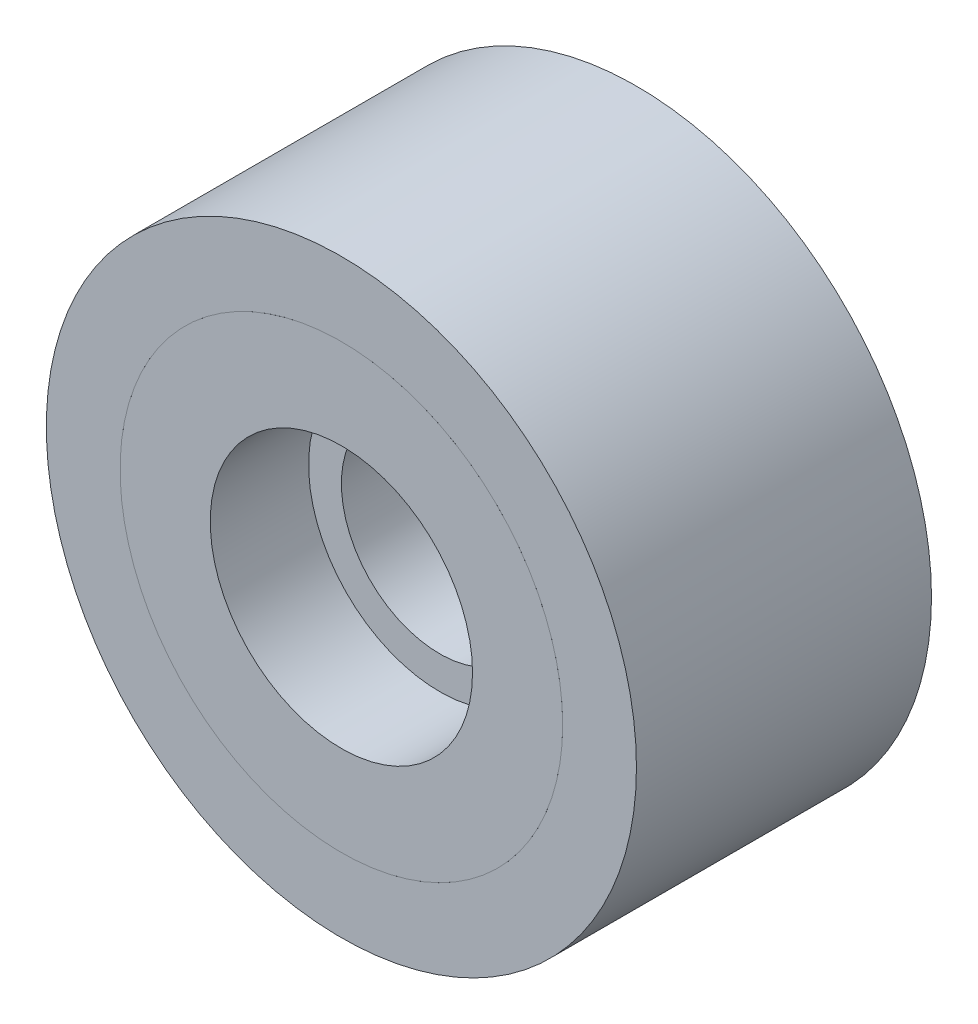
ISO-10303-21;
HEADER;
FILE_DESCRIPTION(('STEP AP214'),'2;1');
FILE_NAME('part.step','',(''),(''),'','','');
FILE_SCHEMA(('AUTOMOTIVE_DESIGN { 1 0 10303 214 1 1 1 1 }'));
ENDSEC;
DATA;
#1=APPLICATION_CONTEXT('core data for automotive mechanical design processes');
#2=APPLICATION_PROTOCOL_DEFINITION('international standard','automotive_design',2000,#1);
#3=PRODUCT_CONTEXT('',#1,'mechanical');
#4=PRODUCT('Part','Part','',(#3));
#5=PRODUCT_RELATED_PRODUCT_CATEGORY('part','',(#4));
#6=PRODUCT_DEFINITION_FORMATION('','',#4);
#7=PRODUCT_DEFINITION_CONTEXT('part definition',#1,'design');
#8=PRODUCT_DEFINITION('design','',#6,#7);
#9=PRODUCT_DEFINITION_SHAPE('','',#8);
#10=(LENGTH_UNIT() NAMED_UNIT(*) SI_UNIT(.MILLI.,.METRE.));
#11=(NAMED_UNIT(*) PLANE_ANGLE_UNIT() SI_UNIT($,.RADIAN.));
#12=(NAMED_UNIT(*) SI_UNIT($,.STERADIAN.) SOLID_ANGLE_UNIT());
#13=UNCERTAINTY_MEASURE_WITH_UNIT(LENGTH_MEASURE(1.E-05),#10,'distance_accuracy_value','');
#14=(GEOMETRIC_REPRESENTATION_CONTEXT(3) GLOBAL_UNCERTAINTY_ASSIGNED_CONTEXT((#13)) GLOBAL_UNIT_ASSIGNED_CONTEXT((#10,
#11,#12)) REPRESENTATION_CONTEXT('',''));
#15=CARTESIAN_POINT('',(0.,0.,0.));
#16=DIRECTION('',(0.,0.,1.));
#17=DIRECTION('',(1.,0.,0.));
#18=AXIS2_PLACEMENT_3D('',#15,#16,#17);
#19=CARTESIAN_POINT('',(0.,27.001,-38.999));
#20=DIRECTION('',(0.,0.,1.));
#21=DIRECTION('',(1.,0.,0.));
#22=AXIS2_PLACEMENT_3D('',#19,#20,#21);
#23=PLANE('',#22);
#24=CARTESIAN_POINT('',(0.,0.,-38.999));
#25=DIRECTION('',(0.,0.,1.));
#26=DIRECTION('',(1.,0.,0.));
#27=AXIS2_PLACEMENT_3D('',#24,#25,#26);
#28=CIRCLE('',#27,36.);
#29=CARTESIAN_POINT('',(36.,0.,-38.999));
#30=VERTEX_POINT('',#29);
#31=EDGE_CURVE('E11',#30,#30,#28,.T.);
#32=ORIENTED_EDGE('',*,*,#31,.F.);
#33=EDGE_LOOP('',(#32));
#34=FACE_BOUND('',#33,.T.);
#35=CARTESIAN_POINT('',(0.,0.,-38.999));
#36=DIRECTION('',(0.,0.,1.));
#37=DIRECTION('',(1.,0.,0.));
#38=AXIS2_PLACEMENT_3D('',#35,#36,#37);
#39=CIRCLE('',#38,27.001);
#40=CARTESIAN_POINT('',(27.001,0.,-38.999));
#41=VERTEX_POINT('',#40);
#42=EDGE_CURVE('E55',#41,#41,#39,.T.);
#43=ORIENTED_EDGE('',*,*,#42,.T.);
#44=EDGE_LOOP('',(#43));
#45=FACE_BOUND('',#44,.T.);
#46=ADVANCED_FACE('F41',(#34,#45),#23,.F.);
#47=CARTESIAN_POINT('',(0.,0.,0.));
#48=DIRECTION('',(0.,0.,1.));
#49=DIRECTION('',(1.,0.,0.));
#50=AXIS2_PLACEMENT_3D('',#47,#48,#49);
#51=CYLINDRICAL_SURFACE('',#50,36.);
#52=CARTESIAN_POINT('',(0.,0.,-3.00099999999999));
#53=DIRECTION('',(0.,0.,1.));
#54=DIRECTION('',(1.,0.,0.));
#55=AXIS2_PLACEMENT_3D('',#52,#53,#54);
#56=CIRCLE('',#55,36.);
#57=CARTESIAN_POINT('',(36.,0.,-3.00099999999999));
#58=VERTEX_POINT('',#57);
#59=EDGE_CURVE('E47',#58,#58,#56,.T.);
#60=ORIENTED_EDGE('',*,*,#59,.F.);
#61=EDGE_LOOP('',(#60));
#62=FACE_BOUND('',#61,.T.);
#63=ORIENTED_EDGE('',*,*,#31,.T.);
#64=EDGE_LOOP('',(#63));
#65=FACE_BOUND('',#64,.T.);
#66=ADVANCED_FACE('F70',(#62,#65),#51,.T.);
#67=CARTESIAN_POINT('',(0.,36.,-3.00099999999999));
#68=DIRECTION('',(0.,0.,-1.));
#69=DIRECTION('',(-1.,0.,0.));
#70=AXIS2_PLACEMENT_3D('',#67,#68,#69);
#71=PLANE('',#70);
#72=CARTESIAN_POINT('',(0.,0.,-3.001));
#73=DIRECTION('',(0.,0.,1.));
#74=DIRECTION('',(1.,0.,0.));
#75=AXIS2_PLACEMENT_3D('',#72,#73,#74);
#76=CIRCLE('',#75,27.001);
#77=CARTESIAN_POINT('',(27.001,0.,-3.001));
#78=VERTEX_POINT('',#77);
#79=EDGE_CURVE('E51',#78,#78,#76,.T.);
#80=ORIENTED_EDGE('',*,*,#79,.F.);
#81=EDGE_LOOP('',(#80));
#82=FACE_BOUND('',#81,.T.);
#83=ORIENTED_EDGE('',*,*,#59,.T.);
#84=EDGE_LOOP('',(#83));
#85=FACE_BOUND('',#84,.T.);
#86=ADVANCED_FACE('F65',(#82,#85),#71,.F.);
#87=CARTESIAN_POINT('',(0.,0.,0.));
#88=DIRECTION('',(0.,0.,1.));
#89=DIRECTION('',(1.,0.,0.));
#90=AXIS2_PLACEMENT_3D('',#87,#88,#89);
#91=CYLINDRICAL_SURFACE('',#90,27.001);
#92=ORIENTED_EDGE('',*,*,#42,.F.);
#93=EDGE_LOOP('',(#92));
#94=FACE_BOUND('',#93,.T.);
#95=ORIENTED_EDGE('',*,*,#79,.T.);
#96=EDGE_LOOP('',(#95));
#97=FACE_BOUND('',#96,.T.);
#98=ADVANCED_FACE('F62',(#94,#97),#91,.F.);
#99=CLOSED_SHELL('',(#46,#66,#86,#98));
#100=MANIFOLD_SOLID_BREP('B2',#99);
#101=CARTESIAN_POINT('',(0.,16.,-15.));
#102=DIRECTION('',(0.,0.,-1.));
#103=DIRECTION('',(-1.,0.,0.));
#104=AXIS2_PLACEMENT_3D('',#101,#102,#103);
#105=PLANE('',#104);
#106=CARTESIAN_POINT('',(0.,0.,-15.));
#107=DIRECTION('',(0.,0.,1.));
#108=DIRECTION('',(1.,0.,0.));
#109=AXIS2_PLACEMENT_3D('',#106,#107,#108);
#110=CIRCLE('',#109,12.);
#111=CARTESIAN_POINT('',(12.,0.,-15.));
#112=VERTEX_POINT('',#111);
#113=EDGE_CURVE('E131',#112,#112,#110,.T.);
#114=ORIENTED_EDGE('',*,*,#113,.F.);
#115=EDGE_LOOP('',(#114));
#116=FACE_BOUND('',#115,.T.);
#117=CARTESIAN_POINT('',(0.,0.,-15.));
#118=DIRECTION('',(0.,0.,1.));
#119=DIRECTION('',(1.,0.,0.));
#120=AXIS2_PLACEMENT_3D('',#117,#118,#119);
#121=CIRCLE('',#120,16.);
#122=CARTESIAN_POINT('',(16.,0.,-15.));
#123=VERTEX_POINT('',#122);
#124=EDGE_CURVE('E40',#123,#123,#121,.T.);
#125=ORIENTED_EDGE('',*,*,#124,.T.);
#126=EDGE_LOOP('',(#125));
#127=FACE_BOUND('',#126,.T.);
#128=ADVANCED_FACE('F103',(#116,#127),#105,.F.);
#129=CARTESIAN_POINT('',(0.,0.,0.));
#130=DIRECTION('',(0.,0.,1.));
#131=DIRECTION('',(1.,0.,0.));
#132=AXIS2_PLACEMENT_3D('',#129,#130,#131);
#133=CYLINDRICAL_SURFACE('',#132,16.);
#134=ORIENTED_EDGE('',*,*,#124,.F.);
#135=EDGE_LOOP('',(#134));
#136=FACE_BOUND('',#135,.T.);
#137=CARTESIAN_POINT('',(0.,0.,-2.99999999999999));
#138=DIRECTION('',(0.,0.,1.));
#139=DIRECTION('',(1.,0.,0.));
#140=AXIS2_PLACEMENT_3D('',#137,#138,#139);
#141=CIRCLE('',#140,16.);
#142=CARTESIAN_POINT('',(16.,0.,-2.99999999999999));
#143=VERTEX_POINT('',#142);
#144=EDGE_CURVE('E109',#143,#143,#141,.T.);
#145=ORIENTED_EDGE('',*,*,#144,.T.);
#146=EDGE_LOOP('',(#145));
#147=FACE_BOUND('',#146,.T.);
#148=ADVANCED_FACE('F183',(#136,#147),#133,.F.);
#149=CARTESIAN_POINT('',(0.,27.,-2.99999999999999));
#150=DIRECTION('',(0.,0.,-1.));
#151=DIRECTION('',(-1.,0.,0.));
#152=AXIS2_PLACEMENT_3D('',#149,#150,#151);
#153=PLANE('',#152);
#154=ORIENTED_EDGE('',*,*,#144,.F.);
#155=EDGE_LOOP('',(#154));
#156=FACE_BOUND('',#155,.T.);
#157=CARTESIAN_POINT('',(0.,0.,-3.));
#158=DIRECTION('',(0.,0.,1.));
#159=DIRECTION('',(1.,0.,0.));
#160=AXIS2_PLACEMENT_3D('',#157,#158,#159);
#161=CIRCLE('',#160,27.);
#162=CARTESIAN_POINT('',(27.,0.,-3.));
#163=VERTEX_POINT('',#162);
#164=EDGE_CURVE('E113',#163,#163,#161,.T.);
#165=ORIENTED_EDGE('',*,*,#164,.T.);
#166=EDGE_LOOP('',(#165));
#167=FACE_BOUND('',#166,.T.);
#168=ADVANCED_FACE('F188',(#156,#167),#153,.F.);
#169=CARTESIAN_POINT('',(0.,0.,0.));
#170=DIRECTION('',(0.,0.,1.));
#171=DIRECTION('',(1.,0.,0.));
#172=AXIS2_PLACEMENT_3D('',#169,#170,#171);
#173=CYLINDRICAL_SURFACE('',#172,27.);
#174=ORIENTED_EDGE('',*,*,#164,.F.);
#175=EDGE_LOOP('',(#174));
#176=FACE_BOUND('',#175,.T.);
#177=CARTESIAN_POINT('',(0.,0.,-39.));
#178=DIRECTION('',(0.,0.,1.));
#179=DIRECTION('',(1.,0.,0.));
#180=AXIS2_PLACEMENT_3D('',#177,#178,#179);
#181=CIRCLE('',#180,27.);
#182=CARTESIAN_POINT('',(27.,0.,-39.));
#183=VERTEX_POINT('',#182);
#184=EDGE_CURVE('E117',#183,#183,#181,.T.);
#185=ORIENTED_EDGE('',*,*,#184,.T.);
#186=EDGE_LOOP('',(#185));
#187=FACE_BOUND('',#186,.T.);
#188=ADVANCED_FACE('F219',(#176,#187),#173,.T.);
#189=CARTESIAN_POINT('',(0.,27.,-39.));
#190=DIRECTION('',(0.,0.,1.));
#191=DIRECTION('',(1.,0.,0.));
#192=AXIS2_PLACEMENT_3D('',#189,#190,#191);
#193=PLANE('',#192);
#194=CARTESIAN_POINT('',(0.,21.,-39.));
#195=DIRECTION('',(0.,0.,1.));
#196=DIRECTION('',(1.,0.,0.));
#197=AXIS2_PLACEMENT_3D('',#194,#195,#196);
#198=CIRCLE('',#197,1.5);
#199=CARTESIAN_POINT('',(1.5,21.,-39.));
#200=VERTEX_POINT('',#199);
#201=EDGE_CURVE('E160',#200,#200,#198,.T.);
#202=ORIENTED_EDGE('',*,*,#201,.T.);
#203=EDGE_LOOP('',(#202));
#204=FACE_BOUND('',#203,.T.);
#205=CARTESIAN_POINT('',(-18.1865334794724,10.4999999999986,-39.));
#206=DIRECTION('',(0.,0.,1.));
#207=DIRECTION('',(1.,0.,0.));
#208=AXIS2_PLACEMENT_3D('',#205,#206,#207);
#209=CIRCLE('',#208,1.5);
#210=CARTESIAN_POINT('',(-16.6865334794724,10.4999999999986,-39.));
#211=VERTEX_POINT('',#210);
#212=EDGE_CURVE('E161',#211,#211,#209,.T.);
#213=ORIENTED_EDGE('',*,*,#212,.T.);
#214=EDGE_LOOP('',(#213));
#215=FACE_BOUND('',#214,.T.);
#216=CARTESIAN_POINT('',(-18.1865334794708,-10.5000000000014,-39.));
#217=DIRECTION('',(0.,0.,1.));
#218=DIRECTION('',(1.,0.,0.));
#219=AXIS2_PLACEMENT_3D('',#216,#217,#218);
#220=CIRCLE('',#219,1.5);
#221=CARTESIAN_POINT('',(-16.6865334794708,-10.5000000000014,-39.));
#222=VERTEX_POINT('',#221);
#223=EDGE_CURVE('E135',#222,#222,#220,.T.);
#224=ORIENTED_EDGE('',*,*,#223,.T.);
#225=EDGE_LOOP('',(#224));
#226=FACE_BOUND('',#225,.T.);
#227=CARTESIAN_POINT('',(3.1911966122448E-12,-21.,-39.));
#228=DIRECTION('',(0.,0.,1.));
#229=DIRECTION('',(1.,0.,0.));
#230=AXIS2_PLACEMENT_3D('',#227,#228,#229);
#231=CIRCLE('',#230,1.5);
#232=CARTESIAN_POINT('',(1.50000000000319,-21.,-39.));
#233=VERTEX_POINT('',#232);
#234=EDGE_CURVE('E142',#233,#233,#231,.T.);
#235=ORIENTED_EDGE('',*,*,#234,.T.);
#236=EDGE_LOOP('',(#235));
#237=FACE_BOUND('',#236,.T.);
#238=CARTESIAN_POINT('',(18.1865334794756,-10.4999999999986,-39.));
#239=DIRECTION('',(0.,0.,1.));
#240=DIRECTION('',(1.,0.,0.));
#241=AXIS2_PLACEMENT_3D('',#238,#239,#240);
#242=CIRCLE('',#241,1.5);
#243=CARTESIAN_POINT('',(19.6865334794756,-10.4999999999986,-39.));
#244=VERTEX_POINT('',#243);
#245=EDGE_CURVE('E148',#244,#244,#242,.T.);
#246=ORIENTED_EDGE('',*,*,#245,.T.);
#247=EDGE_LOOP('',(#246));
#248=FACE_BOUND('',#247,.T.);
#249=CARTESIAN_POINT('',(18.186533479474,10.5000000000014,-39.));
#250=DIRECTION('',(0.,0.,1.));
#251=DIRECTION('',(1.,0.,0.));
#252=AXIS2_PLACEMENT_3D('',#249,#250,#251);
#253=CIRCLE('',#252,1.5);
#254=CARTESIAN_POINT('',(19.686533479474,10.5000000000014,-39.));
#255=VERTEX_POINT('',#254);
#256=EDGE_CURVE('E154',#255,#255,#253,.T.);
#257=ORIENTED_EDGE('',*,*,#256,.T.);
#258=EDGE_LOOP('',(#257));
#259=FACE_BOUND('',#258,.T.);
#260=ORIENTED_EDGE('',*,*,#184,.F.);
#261=EDGE_LOOP('',(#260));
#262=FACE_BOUND('',#261,.T.);
#263=CARTESIAN_POINT('',(0.,0.,-39.));
#264=DIRECTION('',(0.,0.,1.));
#265=DIRECTION('',(1.,0.,0.));
#266=AXIS2_PLACEMENT_3D('',#263,#264,#265);
#267=CIRCLE('',#266,16.);
#268=CARTESIAN_POINT('',(16.,0.,-39.));
#269=VERTEX_POINT('',#268);
#270=EDGE_CURVE('E122',#269,#269,#267,.T.);
#271=ORIENTED_EDGE('',*,*,#270,.T.);
#272=EDGE_LOOP('',(#271));
#273=FACE_BOUND('',#272,.T.);
#274=ADVANCED_FACE('F215',(#204,#215,#226,#237,#248,#259,#262,#273),#193,.F.);
#275=CARTESIAN_POINT('',(0.,0.,0.));
#276=DIRECTION('',(0.,0.,1.));
#277=DIRECTION('',(1.,0.,0.));
#278=AXIS2_PLACEMENT_3D('',#275,#276,#277);
#279=CYLINDRICAL_SURFACE('',#278,16.);
#280=ORIENTED_EDGE('',*,*,#270,.F.);
#281=EDGE_LOOP('',(#280));
#282=FACE_BOUND('',#281,.T.);
#283=CARTESIAN_POINT('',(0.,0.,-27.));
#284=DIRECTION('',(0.,0.,1.));
#285=DIRECTION('',(1.,0.,0.));
#286=AXIS2_PLACEMENT_3D('',#283,#284,#285);
#287=CIRCLE('',#286,16.);
#288=CARTESIAN_POINT('',(16.,0.,-27.));
#289=VERTEX_POINT('',#288);
#290=EDGE_CURVE('E125',#289,#289,#287,.T.);
#291=ORIENTED_EDGE('',*,*,#290,.T.);
#292=EDGE_LOOP('',(#291));
#293=FACE_BOUND('',#292,.T.);
#294=ADVANCED_FACE('F205',(#282,#293),#279,.F.);
#295=CARTESIAN_POINT('',(0.,16.,-27.));
#296=DIRECTION('',(0.,0.,1.));
#297=DIRECTION('',(1.,0.,0.));
#298=AXIS2_PLACEMENT_3D('',#295,#296,#297);
#299=PLANE('',#298);
#300=ORIENTED_EDGE('',*,*,#290,.F.);
#301=EDGE_LOOP('',(#300));
#302=FACE_BOUND('',#301,.T.);
#303=CARTESIAN_POINT('',(0.,0.,-27.));
#304=DIRECTION('',(0.,0.,1.));
#305=DIRECTION('',(1.,0.,0.));
#306=AXIS2_PLACEMENT_3D('',#303,#304,#305);
#307=CIRCLE('',#306,12.);
#308=CARTESIAN_POINT('',(12.,0.,-27.));
#309=VERTEX_POINT('',#308);
#310=EDGE_CURVE('E128',#309,#309,#307,.T.);
#311=ORIENTED_EDGE('',*,*,#310,.T.);
#312=EDGE_LOOP('',(#311));
#313=FACE_BOUND('',#312,.T.);
#314=ADVANCED_FACE('F195',(#302,#313),#299,.F.);
#315=CARTESIAN_POINT('',(0.,0.,0.));
#316=DIRECTION('',(0.,0.,1.));
#317=DIRECTION('',(1.,0.,0.));
#318=AXIS2_PLACEMENT_3D('',#315,#316,#317);
#319=CYLINDRICAL_SURFACE('',#318,12.);
#320=ORIENTED_EDGE('',*,*,#310,.F.);
#321=EDGE_LOOP('',(#320));
#322=FACE_BOUND('',#321,.T.);
#323=ORIENTED_EDGE('',*,*,#113,.T.);
#324=EDGE_LOOP('',(#323));
#325=FACE_BOUND('',#324,.T.);
#326=ADVANCED_FACE('F192',(#322,#325),#319,.F.);
#327=CARTESIAN_POINT('',(18.186533479474,10.5000000000014,-8.99999999999999));
#328=DIRECTION('',(0.,0.,-1.));
#329=DIRECTION('',(-1.,0.,0.));
#330=AXIS2_PLACEMENT_3D('',#327,#328,#329);
#331=CYLINDRICAL_SURFACE('',#330,1.5);
#332=CARTESIAN_POINT('',(18.186533479474,10.5000000000014,-8.99999999999999));
#333=DIRECTION('',(0.,0.,1.));
#334=DIRECTION('',(1.,0.,0.));
#335=AXIS2_PLACEMENT_3D('',#332,#333,#334);
#336=CIRCLE('',#335,1.5);
#337=CARTESIAN_POINT('',(19.686533479474,10.5000000000014,-8.99999999999999));
#338=VERTEX_POINT('',#337);
#339=EDGE_CURVE('E157',#338,#338,#336,.T.);
#340=ORIENTED_EDGE('',*,*,#339,.T.);
#341=EDGE_LOOP('',(#340));
#342=FACE_BOUND('',#341,.T.);
#343=ORIENTED_EDGE('',*,*,#256,.F.);
#344=EDGE_LOOP('',(#343));
#345=FACE_BOUND('',#344,.T.);
#346=ADVANCED_FACE('F194',(#342,#345),#331,.F.);
#347=CARTESIAN_POINT('',(18.186533479474,10.5000000000014,-8.99999999999999));
#348=DIRECTION('',(0.,0.,1.));
#349=DIRECTION('',(1.,0.,0.));
#350=AXIS2_PLACEMENT_3D('',#347,#348,#349);
#351=PLANE('',#350);
#352=ORIENTED_EDGE('',*,*,#339,.F.);
#353=EDGE_LOOP('',(#352));
#354=FACE_BOUND('',#353,.T.);
#355=ADVANCED_FACE('F202',(#354),#351,.F.);
#356=CARTESIAN_POINT('',(18.1865334794756,-10.4999999999986,-8.99999999999999));
#357=DIRECTION('',(0.,0.,-1.));
#358=DIRECTION('',(-1.,0.,0.));
#359=AXIS2_PLACEMENT_3D('',#356,#357,#358);
#360=CYLINDRICAL_SURFACE('',#359,1.5);
#361=CARTESIAN_POINT('',(18.1865334794756,-10.4999999999986,-8.99999999999999));
#362=DIRECTION('',(0.,0.,1.));
#363=DIRECTION('',(1.,0.,0.));
#364=AXIS2_PLACEMENT_3D('',#361,#362,#363);
#365=CIRCLE('',#364,1.5);
#366=CARTESIAN_POINT('',(19.6865334794756,-10.4999999999986,-8.99999999999999));
#367=VERTEX_POINT('',#366);
#368=EDGE_CURVE('E151',#367,#367,#365,.T.);
#369=ORIENTED_EDGE('',*,*,#368,.T.);
#370=EDGE_LOOP('',(#369));
#371=FACE_BOUND('',#370,.T.);
#372=ORIENTED_EDGE('',*,*,#245,.F.);
#373=EDGE_LOOP('',(#372));
#374=FACE_BOUND('',#373,.T.);
#375=ADVANCED_FACE('F277',(#371,#374),#360,.F.);
#376=CARTESIAN_POINT('',(18.1865334794756,-10.4999999999986,-8.99999999999999));
#377=DIRECTION('',(0.,0.,1.));
#378=DIRECTION('',(1.,0.,0.));
#379=AXIS2_PLACEMENT_3D('',#376,#377,#378);
#380=PLANE('',#379);
#381=ORIENTED_EDGE('',*,*,#368,.F.);
#382=EDGE_LOOP('',(#381));
#383=FACE_BOUND('',#382,.T.);
#384=ADVANCED_FACE('F286',(#383),#380,.F.);
#385=CARTESIAN_POINT('',(3.1911966122448E-12,-21.,-8.99999999999999));
#386=DIRECTION('',(0.,0.,-1.));
#387=DIRECTION('',(-1.,0.,0.));
#388=AXIS2_PLACEMENT_3D('',#385,#386,#387);
#389=CYLINDRICAL_SURFACE('',#388,1.5);
#390=CARTESIAN_POINT('',(3.1911966122448E-12,-21.,-8.99999999999999));
#391=DIRECTION('',(0.,0.,1.));
#392=DIRECTION('',(1.,0.,0.));
#393=AXIS2_PLACEMENT_3D('',#390,#391,#392);
#394=CIRCLE('',#393,1.5);
#395=CARTESIAN_POINT('',(1.50000000000319,-21.,-8.99999999999999));
#396=VERTEX_POINT('',#395);
#397=EDGE_CURVE('E145',#396,#396,#394,.T.);
#398=ORIENTED_EDGE('',*,*,#397,.T.);
#399=EDGE_LOOP('',(#398));
#400=FACE_BOUND('',#399,.T.);
#401=ORIENTED_EDGE('',*,*,#234,.F.);
#402=EDGE_LOOP('',(#401));
#403=FACE_BOUND('',#402,.T.);
#404=ADVANCED_FACE('F295',(#400,#403),#389,.F.);
#405=CARTESIAN_POINT('',(3.1911966122448E-12,-21.,-8.99999999999999));
#406=DIRECTION('',(0.,0.,1.));
#407=DIRECTION('',(1.,0.,0.));
#408=AXIS2_PLACEMENT_3D('',#405,#406,#407);
#409=PLANE('',#408);
#410=ORIENTED_EDGE('',*,*,#397,.F.);
#411=EDGE_LOOP('',(#410));
#412=FACE_BOUND('',#411,.T.);
#413=ADVANCED_FACE('F304',(#412),#409,.F.);
#414=CARTESIAN_POINT('',(-18.1865334794708,-10.5000000000014,-8.99999999999999));
#415=DIRECTION('',(0.,0.,-1.));
#416=DIRECTION('',(-1.,0.,0.));
#417=AXIS2_PLACEMENT_3D('',#414,#415,#416);
#418=CYLINDRICAL_SURFACE('',#417,1.5);
#419=CARTESIAN_POINT('',(-18.1865334794708,-10.5000000000014,-8.99999999999999));
#420=DIRECTION('',(0.,0.,1.));
#421=DIRECTION('',(1.,0.,0.));
#422=AXIS2_PLACEMENT_3D('',#419,#420,#421);
#423=CIRCLE('',#422,1.5);
#424=CARTESIAN_POINT('',(-16.6865334794708,-10.5000000000014,-8.99999999999999));
#425=VERTEX_POINT('',#424);
#426=EDGE_CURVE('E138',#425,#425,#423,.T.);
#427=ORIENTED_EDGE('',*,*,#426,.T.);
#428=EDGE_LOOP('',(#427));
#429=FACE_BOUND('',#428,.T.);
#430=ORIENTED_EDGE('',*,*,#223,.F.);
#431=EDGE_LOOP('',(#430));
#432=FACE_BOUND('',#431,.T.);
#433=ADVANCED_FACE('F210',(#429,#432),#418,.F.);
#434=CARTESIAN_POINT('',(-18.1865334794708,-10.5000000000014,-8.99999999999999));
#435=DIRECTION('',(0.,0.,1.));
#436=DIRECTION('',(1.,0.,0.));
#437=AXIS2_PLACEMENT_3D('',#434,#435,#436);
#438=PLANE('',#437);
#439=ORIENTED_EDGE('',*,*,#426,.F.);
#440=EDGE_LOOP('',(#439));
#441=FACE_BOUND('',#440,.T.);
#442=ADVANCED_FACE('F321',(#441),#438,.F.);
#443=CARTESIAN_POINT('',(-18.1865334794724,10.4999999999986,-8.99999999999999));
#444=DIRECTION('',(0.,0.,-1.));
#445=DIRECTION('',(-1.,0.,0.));
#446=AXIS2_PLACEMENT_3D('',#443,#444,#445);
#447=CYLINDRICAL_SURFACE('',#446,1.5);
#448=CARTESIAN_POINT('',(-18.1865334794724,10.4999999999986,-8.99999999999999));
#449=DIRECTION('',(0.,0.,1.));
#450=DIRECTION('',(1.,0.,0.));
#451=AXIS2_PLACEMENT_3D('',#448,#449,#450);
#452=CIRCLE('',#451,1.5);
#453=CARTESIAN_POINT('',(-16.6865334794724,10.4999999999986,-8.99999999999999));
#454=VERTEX_POINT('',#453);
#455=EDGE_CURVE('E139',#454,#454,#452,.T.);
#456=ORIENTED_EDGE('',*,*,#455,.T.);
#457=EDGE_LOOP('',(#456));
#458=FACE_BOUND('',#457,.T.);
#459=ORIENTED_EDGE('',*,*,#212,.F.);
#460=EDGE_LOOP('',(#459));
#461=FACE_BOUND('',#460,.T.);
#462=ADVANCED_FACE('F329',(#458,#461),#447,.F.);
#463=CARTESIAN_POINT('',(-18.1865334794724,10.4999999999986,-8.99999999999999));
#464=DIRECTION('',(0.,0.,1.));
#465=DIRECTION('',(1.,0.,0.));
#466=AXIS2_PLACEMENT_3D('',#463,#464,#465);
#467=PLANE('',#466);
#468=ORIENTED_EDGE('',*,*,#455,.F.);
#469=EDGE_LOOP('',(#468));
#470=FACE_BOUND('',#469,.T.);
#471=ADVANCED_FACE('F180',(#470),#467,.F.);
#472=CARTESIAN_POINT('',(0.,21.,-8.99999999999999));
#473=DIRECTION('',(0.,0.,-1.));
#474=DIRECTION('',(-1.,0.,0.));
#475=AXIS2_PLACEMENT_3D('',#472,#473,#474);
#476=CYLINDRICAL_SURFACE('',#475,1.5);
#477=CARTESIAN_POINT('',(0.,21.,-8.99999999999999));
#478=DIRECTION('',(0.,0.,1.));
#479=DIRECTION('',(1.,0.,0.));
#480=AXIS2_PLACEMENT_3D('',#477,#478,#479);
#481=CIRCLE('',#480,1.5);
#482=CARTESIAN_POINT('',(1.5,21.,-8.99999999999999));
#483=VERTEX_POINT('',#482);
#484=EDGE_CURVE('E134',#483,#483,#481,.T.);
#485=ORIENTED_EDGE('',*,*,#484,.T.);
#486=EDGE_LOOP('',(#485));
#487=FACE_BOUND('',#486,.T.);
#488=ORIENTED_EDGE('',*,*,#201,.F.);
#489=EDGE_LOOP('',(#488));
#490=FACE_BOUND('',#489,.T.);
#491=ADVANCED_FACE('F171',(#487,#490),#476,.F.);
#492=CARTESIAN_POINT('',(0.,21.,-8.99999999999999));
#493=DIRECTION('',(0.,0.,1.));
#494=DIRECTION('',(1.,0.,0.));
#495=AXIS2_PLACEMENT_3D('',#492,#493,#494);
#496=PLANE('',#495);
#497=ORIENTED_EDGE('',*,*,#484,.F.);
#498=EDGE_LOOP('',(#497));
#499=FACE_BOUND('',#498,.T.);
#500=ADVANCED_FACE('F174',(#499),#496,.F.);
#501=CLOSED_SHELL('',(#128,#148,#168,#188,#274,#294,#314,#326,#346,#355,#375,#384,#404,#413,
#433,#442,#462,#471,#491,#500));
#502=MANIFOLD_SOLID_BREP('B6',#501);
#503=ADVANCED_BREP_SHAPE_REPRESENTATION('',(#18,#100,#502),#14);
#504=SHAPE_DEFINITION_REPRESENTATION(#9,#503);
ENDSEC;
END-ISO-10303-21;
